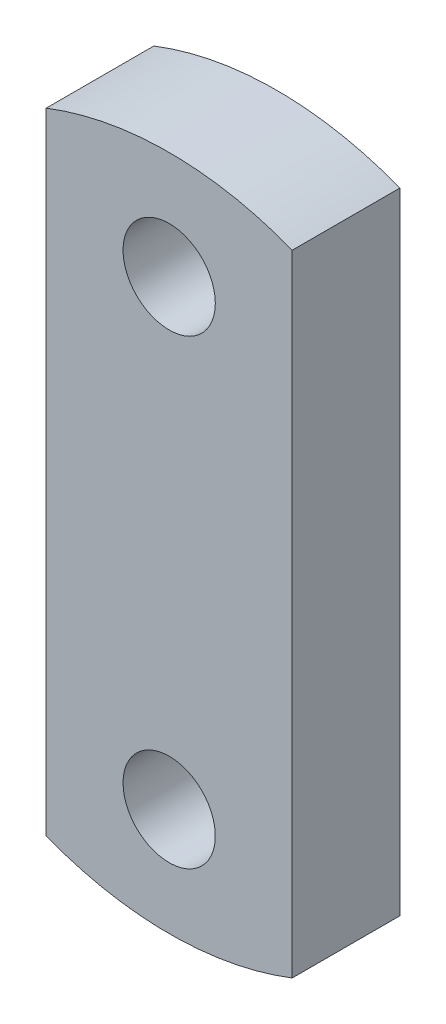
ISO-10303-21;
HEADER;
FILE_DESCRIPTION(('STEP AP214'),'2;1');
FILE_NAME('part.step','',(''),(''),'','','');
FILE_SCHEMA(('AUTOMOTIVE_DESIGN { 1 0 10303 214 1 1 1 1 }'));
ENDSEC;
DATA;
#1=APPLICATION_CONTEXT('core data for automotive mechanical design processes');
#2=APPLICATION_PROTOCOL_DEFINITION('international standard','automotive_design',2000,#1);
#3=PRODUCT_CONTEXT('',#1,'mechanical');
#4=PRODUCT('Part','Part','',(#3));
#5=PRODUCT_RELATED_PRODUCT_CATEGORY('part','',(#4));
#6=PRODUCT_DEFINITION_FORMATION('','',#4);
#7=PRODUCT_DEFINITION_CONTEXT('part definition',#1,'design');
#8=PRODUCT_DEFINITION('design','',#6,#7);
#9=PRODUCT_DEFINITION_SHAPE('','',#8);
#10=(LENGTH_UNIT() NAMED_UNIT(*) SI_UNIT(.MILLI.,.METRE.));
#11=(NAMED_UNIT(*) PLANE_ANGLE_UNIT() SI_UNIT($,.RADIAN.));
#12=(NAMED_UNIT(*) SI_UNIT($,.STERADIAN.) SOLID_ANGLE_UNIT());
#13=UNCERTAINTY_MEASURE_WITH_UNIT(LENGTH_MEASURE(1.E-05),#10,'distance_accuracy_value','');
#14=(GEOMETRIC_REPRESENTATION_CONTEXT(3) GLOBAL_UNCERTAINTY_ASSIGNED_CONTEXT((#13)) GLOBAL_UNIT_ASSIGNED_CONTEXT((#10,
#11,#12)) REPRESENTATION_CONTEXT('',''));
#15=CARTESIAN_POINT('',(0.,0.,0.));
#16=DIRECTION('',(0.,0.,1.));
#17=DIRECTION('',(1.,0.,0.));
#18=AXIS2_PLACEMENT_3D('',#15,#16,#17);
#19=CARTESIAN_POINT('',(0.,0.,35.));
#20=DIRECTION('',(0.,0.,1.));
#21=DIRECTION('',(1.,0.,0.));
#22=AXIS2_PLACEMENT_3D('',#19,#20,#21);
#23=PLANE('',#22);
#24=CARTESIAN_POINT('',(0.,75.,35.));
#25=DIRECTION('',(0.,0.,1.));
#26=DIRECTION('',(1.,0.,0.));
#27=AXIS2_PLACEMENT_3D('',#24,#25,#26);
#28=CIRCLE('',#27,15.);
#29=CARTESIAN_POINT('',(15.,75.,35.));
#30=VERTEX_POINT('',#29);
#31=EDGE_CURVE('E104',#30,#30,#28,.T.);
#32=ORIENTED_EDGE('',*,*,#31,.F.);
#33=EDGE_LOOP('',(#32));
#34=FACE_BOUND('',#33,.T.);
#35=CARTESIAN_POINT('',(0.,0.,35.));
#36=DIRECTION('',(0.,0.,1.));
#37=DIRECTION('',(1.,0.,0.));
#38=AXIS2_PLACEMENT_3D('',#35,#36,#37);
#39=CIRCLE('',#38,110.);
#40=CARTESIAN_POINT('',(40.,102.469507659596,35.));
#41=VERTEX_POINT('',#40);
#42=CARTESIAN_POINT('',(-40.,102.469507659596,35.));
#43=VERTEX_POINT('',#42);
#44=EDGE_CURVE('E89',#41,#43,#39,.T.);
#45=ORIENTED_EDGE('',*,*,#44,.T.);
#46=DIRECTION('',(0.,-1.,0.));
#47=VECTOR('',#46,1.);
#48=CARTESIAN_POINT('',(-40.,102.469507659596,35.));
#49=LINE('',#48,#47);
#50=CARTESIAN_POINT('',(-40.,-102.469507659596,35.));
#51=VERTEX_POINT('',#50);
#52=EDGE_CURVE('E84',#43,#51,#49,.T.);
#53=ORIENTED_EDGE('',*,*,#52,.T.);
#54=CARTESIAN_POINT('',(0.,0.,35.));
#55=DIRECTION('',(0.,0.,1.));
#56=DIRECTION('',(1.,0.,0.));
#57=AXIS2_PLACEMENT_3D('',#54,#55,#56);
#58=CIRCLE('',#57,110.);
#59=CARTESIAN_POINT('',(40.,-102.469507659596,35.));
#60=VERTEX_POINT('',#59);
#61=EDGE_CURVE('E87',#51,#60,#58,.T.);
#62=ORIENTED_EDGE('',*,*,#61,.T.);
#63=DIRECTION('',(0.,1.,0.));
#64=VECTOR('',#63,1.);
#65=CARTESIAN_POINT('',(40.,102.469507659596,35.));
#66=LINE('',#65,#64);
#67=EDGE_CURVE('E54',#60,#41,#66,.T.);
#68=ORIENTED_EDGE('',*,*,#67,.T.);
#69=EDGE_LOOP('',(#45,#53,#62,#68));
#70=FACE_BOUND('',#69,.T.);
#71=CARTESIAN_POINT('',(0.,-75.,35.));
#72=DIRECTION('',(0.,0.,1.));
#73=DIRECTION('',(-1.,0.,0.));
#74=AXIS2_PLACEMENT_3D('',#71,#72,#73);
#75=CIRCLE('',#74,15.);
#76=CARTESIAN_POINT('',(-15.,-75.,35.));
#77=VERTEX_POINT('',#76);
#78=EDGE_CURVE('E119',#77,#77,#75,.T.);
#79=ORIENTED_EDGE('',*,*,#78,.F.);
#80=EDGE_LOOP('',(#79));
#81=FACE_BOUND('',#80,.T.);
#82=ADVANCED_FACE('F37',(#34,#70,#81),#23,.T.);
#83=CARTESIAN_POINT('',(0.,0.,0.));
#84=DIRECTION('',(0.,0.,1.));
#85=DIRECTION('',(1.,0.,0.));
#86=AXIS2_PLACEMENT_3D('',#83,#84,#85);
#87=PLANE('',#86);
#88=CARTESIAN_POINT('',(0.,0.,0.));
#89=DIRECTION('',(0.,0.,1.));
#90=DIRECTION('',(1.,0.,0.));
#91=AXIS2_PLACEMENT_3D('',#88,#89,#90);
#92=CIRCLE('',#91,110.);
#93=CARTESIAN_POINT('',(40.,102.469507659596,0.));
#94=VERTEX_POINT('',#93);
#95=CARTESIAN_POINT('',(-40.,102.469507659596,0.));
#96=VERTEX_POINT('',#95);
#97=EDGE_CURVE('E101',#94,#96,#92,.T.);
#98=ORIENTED_EDGE('',*,*,#97,.F.);
#99=DIRECTION('',(0.,1.,0.));
#100=VECTOR('',#99,1.);
#101=CARTESIAN_POINT('',(40.,102.469507659596,0.));
#102=LINE('',#101,#100);
#103=CARTESIAN_POINT('',(40.,-102.469507659596,0.));
#104=VERTEX_POINT('',#103);
#105=EDGE_CURVE('E77',#104,#94,#102,.T.);
#106=ORIENTED_EDGE('',*,*,#105,.F.);
#107=CARTESIAN_POINT('',(0.,0.,0.));
#108=DIRECTION('',(0.,0.,1.));
#109=DIRECTION('',(1.,0.,0.));
#110=AXIS2_PLACEMENT_3D('',#107,#108,#109);
#111=CIRCLE('',#110,110.);
#112=CARTESIAN_POINT('',(-40.,-102.469507659596,0.));
#113=VERTEX_POINT('',#112);
#114=EDGE_CURVE('E71',#113,#104,#111,.T.);
#115=ORIENTED_EDGE('',*,*,#114,.F.);
#116=DIRECTION('',(0.,-1.,0.));
#117=VECTOR('',#116,1.);
#118=CARTESIAN_POINT('',(-40.,102.469507659596,0.));
#119=LINE('',#118,#117);
#120=EDGE_CURVE('E93',#96,#113,#119,.T.);
#121=ORIENTED_EDGE('',*,*,#120,.F.);
#122=EDGE_LOOP('',(#98,#106,#115,#121));
#123=FACE_BOUND('',#122,.T.);
#124=CARTESIAN_POINT('',(0.,75.,0.));
#125=DIRECTION('',(0.,0.,1.));
#126=DIRECTION('',(1.,0.,0.));
#127=AXIS2_PLACEMENT_3D('',#124,#125,#126);
#128=CIRCLE('',#127,15.);
#129=CARTESIAN_POINT('',(15.,75.,0.));
#130=VERTEX_POINT('',#129);
#131=EDGE_CURVE('E116',#130,#130,#128,.T.);
#132=ORIENTED_EDGE('',*,*,#131,.T.);
#133=EDGE_LOOP('',(#132));
#134=FACE_BOUND('',#133,.T.);
#135=CARTESIAN_POINT('',(0.,-75.,0.));
#136=DIRECTION('',(0.,0.,1.));
#137=DIRECTION('',(-1.,0.,0.));
#138=AXIS2_PLACEMENT_3D('',#135,#136,#137);
#139=CIRCLE('',#138,15.);
#140=CARTESIAN_POINT('',(-15.,-75.,0.));
#141=VERTEX_POINT('',#140);
#142=EDGE_CURVE('E122',#141,#141,#139,.T.);
#143=ORIENTED_EDGE('',*,*,#142,.T.);
#144=EDGE_LOOP('',(#143));
#145=FACE_BOUND('',#144,.T.);
#146=ADVANCED_FACE('F112',(#123,#134,#145),#87,.F.);
#147=CARTESIAN_POINT('',(0.,0.,35.));
#148=DIRECTION('',(0.,0.,-1.));
#149=DIRECTION('',(-1.,0.,0.));
#150=AXIS2_PLACEMENT_3D('',#147,#148,#149);
#151=CYLINDRICAL_SURFACE('',#150,110.);
#152=ORIENTED_EDGE('',*,*,#97,.T.);
#153=DIRECTION('',(0.,0.,-1.));
#154=VECTOR('',#153,1.);
#155=CARTESIAN_POINT('',(-40.,102.469507659596,35.));
#156=LINE('',#155,#154);
#157=EDGE_CURVE('E11',#43,#96,#156,.T.);
#158=ORIENTED_EDGE('',*,*,#157,.F.);
#159=ORIENTED_EDGE('',*,*,#44,.F.);
#160=DIRECTION('',(0.,0.,-1.));
#161=VECTOR('',#160,1.);
#162=CARTESIAN_POINT('',(40.,102.469507659596,35.));
#163=LINE('',#162,#161);
#164=EDGE_CURVE('E97',#41,#94,#163,.T.);
#165=ORIENTED_EDGE('',*,*,#164,.T.);
#166=EDGE_LOOP('',(#152,#158,#159,#165));
#167=FACE_BOUND('',#166,.T.);
#168=ADVANCED_FACE('F39',(#167),#151,.T.);
#169=CARTESIAN_POINT('',(-40.,102.469507659596,35.));
#170=DIRECTION('',(1.,0.,0.));
#171=DIRECTION('',(0.,1.,0.));
#172=AXIS2_PLACEMENT_3D('',#169,#170,#171);
#173=PLANE('',#172);
#174=ORIENTED_EDGE('',*,*,#120,.T.);
#175=DIRECTION('',(0.,0.,-1.));
#176=VECTOR('',#175,1.);
#177=CARTESIAN_POINT('',(-40.,-102.469507659596,35.));
#178=LINE('',#177,#176);
#179=EDGE_CURVE('E46',#51,#113,#178,.T.);
#180=ORIENTED_EDGE('',*,*,#179,.F.);
#181=ORIENTED_EDGE('',*,*,#52,.F.);
#182=ORIENTED_EDGE('',*,*,#157,.T.);
#183=EDGE_LOOP('',(#174,#180,#181,#182));
#184=FACE_BOUND('',#183,.T.);
#185=ADVANCED_FACE('F92',(#184),#173,.F.);
#186=CARTESIAN_POINT('',(0.,0.,35.));
#187=DIRECTION('',(0.,0.,-1.));
#188=DIRECTION('',(-1.,0.,0.));
#189=AXIS2_PLACEMENT_3D('',#186,#187,#188);
#190=CYLINDRICAL_SURFACE('',#189,110.);
#191=ORIENTED_EDGE('',*,*,#114,.T.);
#192=DIRECTION('',(0.,0.,-1.));
#193=VECTOR('',#192,1.);
#194=CARTESIAN_POINT('',(40.,-102.469507659596,35.));
#195=LINE('',#194,#193);
#196=EDGE_CURVE('E94',#60,#104,#195,.T.);
#197=ORIENTED_EDGE('',*,*,#196,.F.);
#198=ORIENTED_EDGE('',*,*,#61,.F.);
#199=ORIENTED_EDGE('',*,*,#179,.T.);
#200=EDGE_LOOP('',(#191,#197,#198,#199));
#201=FACE_BOUND('',#200,.T.);
#202=ADVANCED_FACE('F95',(#201),#190,.T.);
#203=CARTESIAN_POINT('',(40.,102.469507659596,35.));
#204=DIRECTION('',(-1.,0.,0.));
#205=DIRECTION('',(0.,-1.,0.));
#206=AXIS2_PLACEMENT_3D('',#203,#204,#205);
#207=PLANE('',#206);
#208=ORIENTED_EDGE('',*,*,#105,.T.);
#209=ORIENTED_EDGE('',*,*,#164,.F.);
#210=ORIENTED_EDGE('',*,*,#67,.F.);
#211=ORIENTED_EDGE('',*,*,#196,.T.);
#212=EDGE_LOOP('',(#208,#209,#210,#211));
#213=FACE_BOUND('',#212,.T.);
#214=ADVANCED_FACE('F109',(#213),#207,.F.);
#215=CARTESIAN_POINT('',(0.,75.,35.));
#216=DIRECTION('',(0.,0.,-1.));
#217=DIRECTION('',(-1.,0.,0.));
#218=AXIS2_PLACEMENT_3D('',#215,#216,#217);
#219=CYLINDRICAL_SURFACE('',#218,15.);
#220=ORIENTED_EDGE('',*,*,#31,.T.);
#221=EDGE_LOOP('',(#220));
#222=FACE_BOUND('',#221,.T.);
#223=ORIENTED_EDGE('',*,*,#131,.F.);
#224=EDGE_LOOP('',(#223));
#225=FACE_BOUND('',#224,.T.);
#226=ADVANCED_FACE('F139',(#222,#225),#219,.F.);
#227=CARTESIAN_POINT('',(0.,-75.,35.));
#228=DIRECTION('',(0.,0.,-1.));
#229=DIRECTION('',(-1.,0.,0.));
#230=AXIS2_PLACEMENT_3D('',#227,#228,#229);
#231=CYLINDRICAL_SURFACE('',#230,15.);
#232=ORIENTED_EDGE('',*,*,#78,.T.);
#233=EDGE_LOOP('',(#232));
#234=FACE_BOUND('',#233,.T.);
#235=ORIENTED_EDGE('',*,*,#142,.F.);
#236=EDGE_LOOP('',(#235));
#237=FACE_BOUND('',#236,.T.);
#238=ADVANCED_FACE('F128',(#234,#237),#231,.F.);
#239=CLOSED_SHELL('',(#82,#146,#168,#185,#202,#214,#226,#238));
#240=MANIFOLD_SOLID_BREP('B2',#239);
#241=ADVANCED_BREP_SHAPE_REPRESENTATION('',(#18,#240),#14);
#242=SHAPE_DEFINITION_REPRESENTATION(#9,#241);
ENDSEC;
END-ISO-10303-21;
